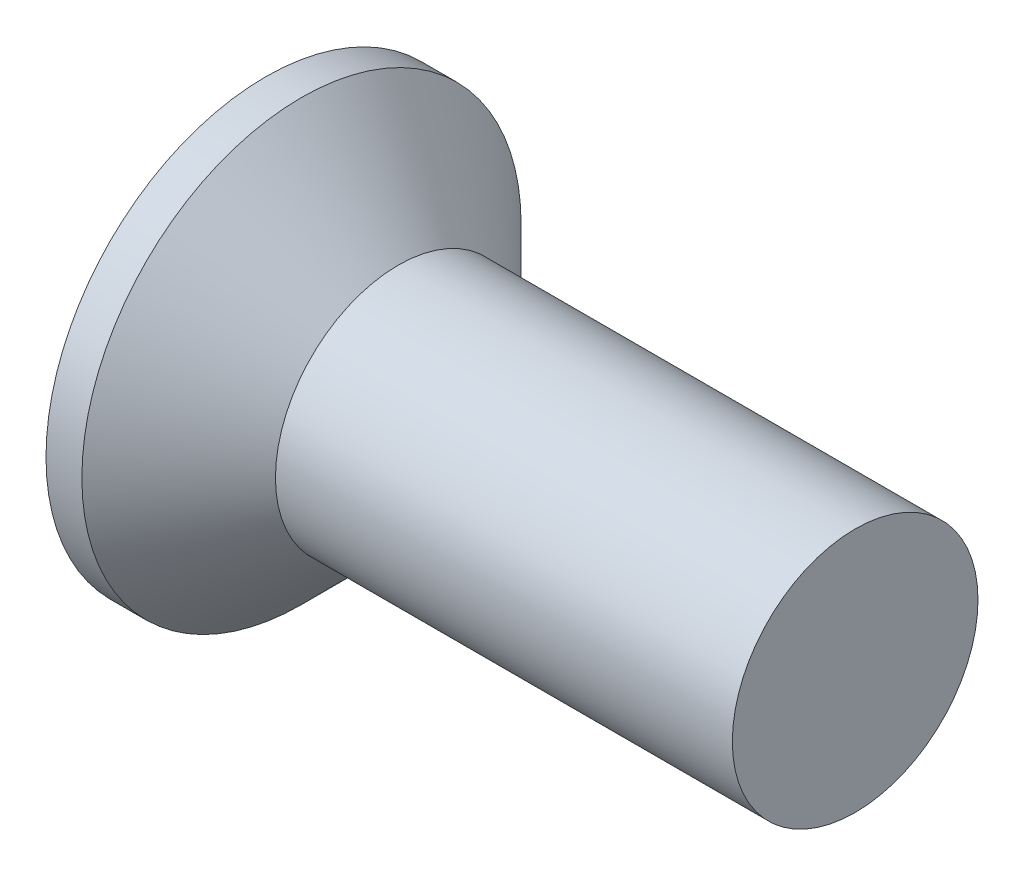
ISO-10303-21;
HEADER;
FILE_DESCRIPTION(('STEP AP214'),'2;1');
FILE_NAME('part.step','',(''),(''),'','','');
FILE_SCHEMA(('AUTOMOTIVE_DESIGN { 1 0 10303 214 1 1 1 1 }'));
ENDSEC;
DATA;
#1=APPLICATION_CONTEXT('core data for automotive mechanical design processes');
#2=APPLICATION_PROTOCOL_DEFINITION('international standard','automotive_design',2000,#1);
#3=PRODUCT_CONTEXT('',#1,'mechanical');
#4=PRODUCT('Part','Part','',(#3));
#5=PRODUCT_RELATED_PRODUCT_CATEGORY('part','',(#4));
#6=PRODUCT_DEFINITION_FORMATION('','',#4);
#7=PRODUCT_DEFINITION_CONTEXT('part definition',#1,'design');
#8=PRODUCT_DEFINITION('design','',#6,#7);
#9=PRODUCT_DEFINITION_SHAPE('','',#8);
#10=(LENGTH_UNIT() NAMED_UNIT(*) SI_UNIT(.MILLI.,.METRE.));
#11=(NAMED_UNIT(*) PLANE_ANGLE_UNIT() SI_UNIT($,.RADIAN.));
#12=(NAMED_UNIT(*) SI_UNIT($,.STERADIAN.) SOLID_ANGLE_UNIT());
#13=UNCERTAINTY_MEASURE_WITH_UNIT(LENGTH_MEASURE(1.E-05),#10,'distance_accuracy_value','');
#14=(GEOMETRIC_REPRESENTATION_CONTEXT(3) GLOBAL_UNCERTAINTY_ASSIGNED_CONTEXT((#13)) GLOBAL_UNIT_ASSIGNED_CONTEXT((#10,
#11,#12)) REPRESENTATION_CONTEXT('',''));
#15=CARTESIAN_POINT('',(0.,0.,0.));
#16=DIRECTION('',(0.,0.,1.));
#17=DIRECTION('',(1.,0.,0.));
#18=AXIS2_PLACEMENT_3D('',#15,#16,#17);
#19=CARTESIAN_POINT('',(1.35,-0.82,-0.82));
#20=DIRECTION('',(-1.,0.,0.));
#21=DIRECTION('',(0.,0.,1.));
#22=AXIS2_PLACEMENT_3D('',#19,#20,#21);
#23=CYLINDRICAL_SURFACE('',#22,0.3);
#24=CARTESIAN_POINT('',(0.,-0.82,-0.82));
#25=DIRECTION('',(-1.,0.,0.));
#26=DIRECTION('',(0.,0.,1.));
#27=AXIS2_PLACEMENT_3D('',#24,#25,#26);
#28=CIRCLE('',#27,0.3);
#29=CARTESIAN_POINT('',(0.,-0.52,-0.82));
#30=VERTEX_POINT('',#29);
#31=CARTESIAN_POINT('',(0.,-0.82,-0.52));
#32=VERTEX_POINT('',#31);
#33=EDGE_CURVE('E19',#30,#32,#28,.F.);
#34=ORIENTED_EDGE('',*,*,#33,.T.);
#35=DIRECTION('',(1.,0.,0.));
#36=VECTOR('',#35,1.);
#37=CARTESIAN_POINT('',(1.35,-0.82,-0.52));
#38=LINE('',#37,#36);
#39=CARTESIAN_POINT('',(1.35,-0.82,-0.52));
#40=VERTEX_POINT('',#39);
#41=EDGE_CURVE('E139',#40,#32,#38,.F.);
#42=ORIENTED_EDGE('',*,*,#41,.F.);
#43=CARTESIAN_POINT('',(1.35,-0.82,-0.82));
#44=DIRECTION('',(-1.,0.,0.));
#45=DIRECTION('',(0.,0.,1.));
#46=AXIS2_PLACEMENT_3D('',#43,#44,#45);
#47=CIRCLE('',#46,0.3);
#48=CARTESIAN_POINT('',(1.35,-0.52,-0.82));
#49=VERTEX_POINT('',#48);
#50=EDGE_CURVE('E296',#40,#49,#47,.T.);
#51=ORIENTED_EDGE('',*,*,#50,.T.);
#52=DIRECTION('',(1.,0.,0.));
#53=VECTOR('',#52,1.);
#54=CARTESIAN_POINT('',(1.35,-0.52,-0.82));
#55=LINE('',#54,#53);
#56=EDGE_CURVE('E243',#30,#49,#55,.T.);
#57=ORIENTED_EDGE('',*,*,#56,.F.);
#58=EDGE_LOOP('',(#34,#42,#51,#57));
#59=FACE_BOUND('',#58,.T.);
#60=ADVANCED_FACE('F16',(#59),#23,.T.);
#61=CARTESIAN_POINT('',(1.35,0.82,-0.82));
#62=DIRECTION('',(-1.,0.,0.));
#63=DIRECTION('',(0.,0.,1.));
#64=AXIS2_PLACEMENT_3D('',#61,#62,#63);
#65=CYLINDRICAL_SURFACE('',#64,0.3);
#66=CARTESIAN_POINT('',(0.,0.82,-0.82));
#67=DIRECTION('',(-1.,0.,0.));
#68=DIRECTION('',(0.,0.,1.));
#69=AXIS2_PLACEMENT_3D('',#66,#67,#68);
#70=CIRCLE('',#69,0.3);
#71=CARTESIAN_POINT('',(0.,0.82,-0.52));
#72=VERTEX_POINT('',#71);
#73=CARTESIAN_POINT('',(0.,0.52,-0.82));
#74=VERTEX_POINT('',#73);
#75=EDGE_CURVE('E303',#72,#74,#70,.F.);
#76=ORIENTED_EDGE('',*,*,#75,.T.);
#77=DIRECTION('',(1.,0.,0.));
#78=VECTOR('',#77,1.);
#79=CARTESIAN_POINT('',(1.35,0.52,-0.82));
#80=LINE('',#79,#78);
#81=CARTESIAN_POINT('',(1.35,0.52,-0.82));
#82=VERTEX_POINT('',#81);
#83=EDGE_CURVE('E222',#82,#74,#80,.F.);
#84=ORIENTED_EDGE('',*,*,#83,.F.);
#85=CARTESIAN_POINT('',(1.35,0.82,-0.82));
#86=DIRECTION('',(-1.,0.,0.));
#87=DIRECTION('',(0.,0.,1.));
#88=AXIS2_PLACEMENT_3D('',#85,#86,#87);
#89=CIRCLE('',#88,0.3);
#90=CARTESIAN_POINT('',(1.35,0.82,-0.52));
#91=VERTEX_POINT('',#90);
#92=EDGE_CURVE('E294',#82,#91,#89,.T.);
#93=ORIENTED_EDGE('',*,*,#92,.T.);
#94=DIRECTION('',(1.,0.,0.));
#95=VECTOR('',#94,1.);
#96=CARTESIAN_POINT('',(1.35,0.82,-0.52));
#97=LINE('',#96,#95);
#98=EDGE_CURVE('E218',#72,#91,#97,.T.);
#99=ORIENTED_EDGE('',*,*,#98,.F.);
#100=EDGE_LOOP('',(#76,#84,#93,#99));
#101=FACE_BOUND('',#100,.T.);
#102=ADVANCED_FACE('F307',(#101),#65,.T.);
#103=CARTESIAN_POINT('',(1.35,0.82,0.82));
#104=DIRECTION('',(-1.,0.,0.));
#105=DIRECTION('',(0.,0.,1.));
#106=AXIS2_PLACEMENT_3D('',#103,#104,#105);
#107=CYLINDRICAL_SURFACE('',#106,0.3);
#108=CARTESIAN_POINT('',(0.,0.82,0.82));
#109=DIRECTION('',(-1.,0.,0.));
#110=DIRECTION('',(0.,0.,1.));
#111=AXIS2_PLACEMENT_3D('',#108,#109,#110);
#112=CIRCLE('',#111,0.3);
#113=CARTESIAN_POINT('',(0.,0.52,0.82));
#114=VERTEX_POINT('',#113);
#115=CARTESIAN_POINT('',(0.,0.82,0.52));
#116=VERTEX_POINT('',#115);
#117=EDGE_CURVE('E302',#114,#116,#112,.F.);
#118=ORIENTED_EDGE('',*,*,#117,.T.);
#119=DIRECTION('',(1.,0.,0.));
#120=VECTOR('',#119,1.);
#121=CARTESIAN_POINT('',(1.35,0.82,0.52));
#122=LINE('',#121,#120);
#123=CARTESIAN_POINT('',(1.35,0.82,0.52));
#124=VERTEX_POINT('',#123);
#125=EDGE_CURVE('E196',#124,#116,#122,.F.);
#126=ORIENTED_EDGE('',*,*,#125,.F.);
#127=CARTESIAN_POINT('',(1.35,0.82,0.82));
#128=DIRECTION('',(-1.,0.,0.));
#129=DIRECTION('',(0.,0.,1.));
#130=AXIS2_PLACEMENT_3D('',#127,#128,#129);
#131=CIRCLE('',#130,0.3);
#132=CARTESIAN_POINT('',(1.35,0.52,0.82));
#133=VERTEX_POINT('',#132);
#134=EDGE_CURVE('E251',#124,#133,#131,.T.);
#135=ORIENTED_EDGE('',*,*,#134,.T.);
#136=DIRECTION('',(1.,0.,0.));
#137=VECTOR('',#136,1.);
#138=CARTESIAN_POINT('',(1.35,0.52,0.82));
#139=LINE('',#138,#137);
#140=EDGE_CURVE('E192',#114,#133,#139,.T.);
#141=ORIENTED_EDGE('',*,*,#140,.F.);
#142=EDGE_LOOP('',(#118,#126,#135,#141));
#143=FACE_BOUND('',#142,.T.);
#144=ADVANCED_FACE('F540',(#143),#107,.T.);
#145=CARTESIAN_POINT('',(1.35,-0.82,0.819999999999999));
#146=DIRECTION('',(-1.,0.,0.));
#147=DIRECTION('',(0.,0.,1.));
#148=AXIS2_PLACEMENT_3D('',#145,#146,#147);
#149=CYLINDRICAL_SURFACE('',#148,0.3);
#150=CARTESIAN_POINT('',(0.,-0.82,0.819999999999999));
#151=DIRECTION('',(-1.,0.,0.));
#152=DIRECTION('',(0.,0.,1.));
#153=AXIS2_PLACEMENT_3D('',#150,#151,#152);
#154=CIRCLE('',#153,0.3);
#155=CARTESIAN_POINT('',(0.,-0.82,0.52));
#156=VERTEX_POINT('',#155);
#157=CARTESIAN_POINT('',(0.,-0.52,0.82));
#158=VERTEX_POINT('',#157);
#159=EDGE_CURVE('E300',#156,#158,#154,.F.);
#160=ORIENTED_EDGE('',*,*,#159,.T.);
#161=DIRECTION('',(1.,0.,0.));
#162=VECTOR('',#161,1.);
#163=CARTESIAN_POINT('',(1.35,-0.52,0.82));
#164=LINE('',#163,#162);
#165=CARTESIAN_POINT('',(1.35,-0.52,0.82));
#166=VERTEX_POINT('',#165);
#167=EDGE_CURVE('E170',#166,#158,#164,.F.);
#168=ORIENTED_EDGE('',*,*,#167,.F.);
#169=CARTESIAN_POINT('',(1.35,-0.82,0.819999999999999));
#170=DIRECTION('',(-1.,0.,0.));
#171=DIRECTION('',(0.,0.,1.));
#172=AXIS2_PLACEMENT_3D('',#169,#170,#171);
#173=CIRCLE('',#172,0.3);
#174=CARTESIAN_POINT('',(1.35,-0.82,0.52));
#175=VERTEX_POINT('',#174);
#176=EDGE_CURVE('E298',#166,#175,#173,.T.);
#177=ORIENTED_EDGE('',*,*,#176,.T.);
#178=DIRECTION('',(1.,0.,0.));
#179=VECTOR('',#178,1.);
#180=CARTESIAN_POINT('',(1.35,-0.82,0.52));
#181=LINE('',#180,#179);
#182=EDGE_CURVE('E162',#156,#175,#181,.T.);
#183=ORIENTED_EDGE('',*,*,#182,.F.);
#184=EDGE_LOOP('',(#160,#168,#177,#183));
#185=FACE_BOUND('',#184,.T.);
#186=ADVANCED_FACE('F531',(#185),#149,.T.);
#187=CARTESIAN_POINT('',(1.35,0.52,0.52));
#188=DIRECTION('',(1.,0.,0.));
#189=DIRECTION('',(0.,0.,-1.));
#190=AXIS2_PLACEMENT_3D('',#187,#188,#189);
#191=PLANE('',#190);
#192=ORIENTED_EDGE('',*,*,#134,.F.);
#193=DIRECTION('',(0.,1.,0.));
#194=VECTOR('',#193,1.);
#195=CARTESIAN_POINT('',(1.35,0.52,0.52));
#196=LINE('',#195,#194);
#197=CARTESIAN_POINT('',(1.35,1.820577136594,0.52));
#198=VERTEX_POINT('',#197);
#199=EDGE_CURVE('E199',#198,#124,#196,.F.);
#200=ORIENTED_EDGE('',*,*,#199,.F.);
#201=DIRECTION('',(0.,0.,1.));
#202=VECTOR('',#201,1.);
#203=CARTESIAN_POINT('',(1.35,1.820577136594,-0.52));
#204=LINE('',#203,#202);
#205=CARTESIAN_POINT('',(1.35,1.820577136594,-0.52));
#206=VERTEX_POINT('',#205);
#207=EDGE_CURVE('E214',#206,#198,#204,.T.);
#208=ORIENTED_EDGE('',*,*,#207,.F.);
#209=DIRECTION('',(0.,1.,0.));
#210=VECTOR('',#209,1.);
#211=CARTESIAN_POINT('',(1.35,0.52,-0.52));
#212=LINE('',#211,#210);
#213=EDGE_CURVE('E215',#91,#206,#212,.T.);
#214=ORIENTED_EDGE('',*,*,#213,.F.);
#215=ORIENTED_EDGE('',*,*,#92,.F.);
#216=DIRECTION('',(0.,0.,-1.));
#217=VECTOR('',#216,1.);
#218=CARTESIAN_POINT('',(1.35,0.52,-0.52));
#219=LINE('',#218,#217);
#220=CARTESIAN_POINT('',(1.35,0.52,-1.820577136594));
#221=VERTEX_POINT('',#220);
#222=EDGE_CURVE('E225',#221,#82,#219,.F.);
#223=ORIENTED_EDGE('',*,*,#222,.F.);
#224=DIRECTION('',(0.,1.,0.));
#225=VECTOR('',#224,1.);
#226=CARTESIAN_POINT('',(1.35,0.52,-1.820577136594));
#227=LINE('',#226,#225);
#228=CARTESIAN_POINT('',(1.35,-0.52,-1.820577136594));
#229=VERTEX_POINT('',#228);
#230=EDGE_CURVE('E239',#229,#221,#227,.T.);
#231=ORIENTED_EDGE('',*,*,#230,.F.);
#232=DIRECTION('',(0.,0.,1.));
#233=VECTOR('',#232,1.);
#234=CARTESIAN_POINT('',(1.35,-0.52,-0.52));
#235=LINE('',#234,#233);
#236=EDGE_CURVE('E240',#49,#229,#235,.F.);
#237=ORIENTED_EDGE('',*,*,#236,.F.);
#238=ORIENTED_EDGE('',*,*,#50,.F.);
#239=DIRECTION('',(0.,1.,0.));
#240=VECTOR('',#239,1.);
#241=CARTESIAN_POINT('',(1.35,-0.52,-0.52));
#242=LINE('',#241,#240);
#243=CARTESIAN_POINT('',(1.35,-1.820577136594,-0.52));
#244=VERTEX_POINT('',#243);
#245=EDGE_CURVE('E246',#244,#40,#242,.T.);
#246=ORIENTED_EDGE('',*,*,#245,.F.);
#247=DIRECTION('',(0.,0.,1.));
#248=VECTOR('',#247,1.);
#249=CARTESIAN_POINT('',(1.35,-1.820577136594,-0.52));
#250=LINE('',#249,#248);
#251=CARTESIAN_POINT('',(1.35,-1.820577136594,0.519999999999999));
#252=VERTEX_POINT('',#251);
#253=EDGE_CURVE('E148',#252,#244,#250,.F.);
#254=ORIENTED_EDGE('',*,*,#253,.F.);
#255=DIRECTION('',(0.,1.,0.));
#256=VECTOR('',#255,1.);
#257=CARTESIAN_POINT('',(1.35,-0.52,0.52));
#258=LINE('',#257,#256);
#259=EDGE_CURVE('E167',#175,#252,#258,.F.);
#260=ORIENTED_EDGE('',*,*,#259,.F.);
#261=ORIENTED_EDGE('',*,*,#176,.F.);
#262=DIRECTION('',(0.,0.,1.));
#263=VECTOR('',#262,1.);
#264=CARTESIAN_POINT('',(1.35,-0.52,0.52));
#265=LINE('',#264,#263);
#266=CARTESIAN_POINT('',(1.35,-0.52,1.820577136594));
#267=VERTEX_POINT('',#266);
#268=EDGE_CURVE('E174',#267,#166,#265,.F.);
#269=ORIENTED_EDGE('',*,*,#268,.F.);
#270=DIRECTION('',(0.,1.,0.));
#271=VECTOR('',#270,1.);
#272=CARTESIAN_POINT('',(1.35,0.52,1.820577136594));
#273=LINE('',#272,#271);
#274=CARTESIAN_POINT('',(1.35,0.52,1.820577136594));
#275=VERTEX_POINT('',#274);
#276=EDGE_CURVE('E188',#275,#267,#273,.F.);
#277=ORIENTED_EDGE('',*,*,#276,.F.);
#278=DIRECTION('',(0.,0.,-1.));
#279=VECTOR('',#278,1.);
#280=CARTESIAN_POINT('',(1.35,0.52,0.52));
#281=LINE('',#280,#279);
#282=EDGE_CURVE('E189',#133,#275,#281,.F.);
#283=ORIENTED_EDGE('',*,*,#282,.F.);
#284=EDGE_LOOP('',(#192,#200,#208,#214,#215,#223,#231,#237,#238,#246,#254,#260,#261,#269,#277,#283));
#285=FACE_BOUND('',#284,.T.);
#286=ADVANCED_FACE('F333',(#285),#191,.F.);
#287=CARTESIAN_POINT('',(1.35,-0.52,-0.52));
#288=DIRECTION('',(0.,0.,1.));
#289=DIRECTION('',(1.,0.,0.));
#290=AXIS2_PLACEMENT_3D('',#287,#288,#289);
#291=PLANE('',#290);
#292=DIRECTION('',(0.,1.,0.));
#293=VECTOR('',#292,1.);
#294=CARTESIAN_POINT('',(0.,4.47,-0.52));
#295=LINE('',#294,#293);
#296=CARTESIAN_POINT('',(0.,-2.6,-0.52));
#297=VERTEX_POINT('',#296);
#298=EDGE_CURVE('E133',#297,#32,#295,.T.);
#299=ORIENTED_EDGE('',*,*,#298,.F.);
#300=DIRECTION('',(-0.866025403784438,-0.500000000000001,0.));
#301=VECTOR('',#300,1.);
#302=CARTESIAN_POINT('',(0.,-2.6,-0.52));
#303=LINE('',#302,#301);
#304=EDGE_CURVE('E137',#244,#297,#303,.T.);
#305=ORIENTED_EDGE('',*,*,#304,.F.);
#306=ORIENTED_EDGE('',*,*,#245,.T.);
#307=ORIENTED_EDGE('',*,*,#41,.T.);
#308=EDGE_LOOP('',(#299,#305,#306,#307));
#309=FACE_BOUND('',#308,.T.);
#310=ADVANCED_FACE('F135',(#309),#291,.T.);
#311=CARTESIAN_POINT('',(1.35,-0.52,-0.52));
#312=DIRECTION('',(0.,1.,0.));
#313=DIRECTION('',(0.,0.,1.));
#314=AXIS2_PLACEMENT_3D('',#311,#312,#313);
#315=PLANE('',#314);
#316=ORIENTED_EDGE('',*,*,#236,.T.);
#317=DIRECTION('',(0.866025403784438,0.,0.500000000000001));
#318=VECTOR('',#317,1.);
#319=CARTESIAN_POINT('',(0.,-0.52,-2.6));
#320=LINE('',#319,#318);
#321=CARTESIAN_POINT('',(0.,-0.52,-2.6));
#322=VERTEX_POINT('',#321);
#323=EDGE_CURVE('E236',#322,#229,#320,.T.);
#324=ORIENTED_EDGE('',*,*,#323,.F.);
#325=DIRECTION('',(0.,0.,1.));
#326=VECTOR('',#325,1.);
#327=CARTESIAN_POINT('',(0.,-0.52,0.));
#328=LINE('',#327,#326);
#329=EDGE_CURVE('E141',#30,#322,#328,.F.);
#330=ORIENTED_EDGE('',*,*,#329,.F.);
#331=ORIENTED_EDGE('',*,*,#56,.T.);
#332=EDGE_LOOP('',(#316,#324,#330,#331));
#333=FACE_BOUND('',#332,.T.);
#334=ADVANCED_FACE('F327',(#333),#315,.T.);
#335=CARTESIAN_POINT('',(0.,0.52,-2.6));
#336=DIRECTION('',(-0.500000000000001,0.,0.866025403784438));
#337=DIRECTION('',(0.866025403784438,0.,0.500000000000001));
#338=AXIS2_PLACEMENT_3D('',#335,#336,#337);
#339=PLANE('',#338);
#340=ORIENTED_EDGE('',*,*,#230,.T.);
#341=DIRECTION('',(0.866025403784438,0.,0.500000000000001));
#342=VECTOR('',#341,1.);
#343=CARTESIAN_POINT('',(0.,0.52,-2.6));
#344=LINE('',#343,#342);
#345=CARTESIAN_POINT('',(0.,0.52,-2.6));
#346=VERTEX_POINT('',#345);
#347=EDGE_CURVE('E221',#346,#221,#344,.T.);
#348=ORIENTED_EDGE('',*,*,#347,.F.);
#349=DIRECTION('',(0.,1.,0.));
#350=VECTOR('',#349,1.);
#351=CARTESIAN_POINT('',(0.,4.47,-2.6));
#352=LINE('',#351,#350);
#353=EDGE_CURVE('E230',#322,#346,#352,.T.);
#354=ORIENTED_EDGE('',*,*,#353,.F.);
#355=ORIENTED_EDGE('',*,*,#323,.T.);
#356=EDGE_LOOP('',(#340,#348,#354,#355));
#357=FACE_BOUND('',#356,.T.);
#358=ADVANCED_FACE('F331',(#357),#339,.T.);
#359=CARTESIAN_POINT('',(1.35,0.52,-0.52));
#360=DIRECTION('',(0.,-1.,0.));
#361=DIRECTION('',(0.,0.,-1.));
#362=AXIS2_PLACEMENT_3D('',#359,#360,#361);
#363=PLANE('',#362);
#364=DIRECTION('',(0.,0.,1.));
#365=VECTOR('',#364,1.);
#366=CARTESIAN_POINT('',(0.,0.52,0.));
#367=LINE('',#366,#365);
#368=EDGE_CURVE('E233',#346,#74,#367,.T.);
#369=ORIENTED_EDGE('',*,*,#368,.F.);
#370=ORIENTED_EDGE('',*,*,#347,.T.);
#371=ORIENTED_EDGE('',*,*,#222,.T.);
#372=ORIENTED_EDGE('',*,*,#83,.T.);
#373=EDGE_LOOP('',(#369,#370,#371,#372));
#374=FACE_BOUND('',#373,.T.);
#375=ADVANCED_FACE('F313',(#374),#363,.T.);
#376=CARTESIAN_POINT('',(1.35,0.52,-0.52));
#377=DIRECTION('',(0.,0.,1.));
#378=DIRECTION('',(1.,0.,0.));
#379=AXIS2_PLACEMENT_3D('',#376,#377,#378);
#380=PLANE('',#379);
#381=ORIENTED_EDGE('',*,*,#213,.T.);
#382=DIRECTION('',(0.866025403784438,-0.500000000000001,0.));
#383=VECTOR('',#382,1.);
#384=CARTESIAN_POINT('',(0.,2.6,-0.52));
#385=LINE('',#384,#383);
#386=CARTESIAN_POINT('',(0.,2.6,-0.52));
#387=VERTEX_POINT('',#386);
#388=EDGE_CURVE('E211',#387,#206,#385,.T.);
#389=ORIENTED_EDGE('',*,*,#388,.F.);
#390=DIRECTION('',(0.,1.,0.));
#391=VECTOR('',#390,1.);
#392=CARTESIAN_POINT('',(0.,4.47,-0.52));
#393=LINE('',#392,#391);
#394=EDGE_CURVE('E208',#72,#387,#393,.T.);
#395=ORIENTED_EDGE('',*,*,#394,.F.);
#396=ORIENTED_EDGE('',*,*,#98,.T.);
#397=EDGE_LOOP('',(#381,#389,#395,#396));
#398=FACE_BOUND('',#397,.T.);
#399=ADVANCED_FACE('F337',(#398),#380,.T.);
#400=CARTESIAN_POINT('',(0.,2.6,-0.52));
#401=DIRECTION('',(-0.500000000000001,-0.866025403784438,0.));
#402=DIRECTION('',(0.866025403784438,-0.500000000000001,0.));
#403=AXIS2_PLACEMENT_3D('',#400,#401,#402);
#404=PLANE('',#403);
#405=ORIENTED_EDGE('',*,*,#207,.T.);
#406=DIRECTION('',(0.866025403784438,-0.500000000000001,0.));
#407=VECTOR('',#406,1.);
#408=CARTESIAN_POINT('',(0.,2.6,0.52));
#409=LINE('',#408,#407);
#410=CARTESIAN_POINT('',(0.,2.6,0.52));
#411=VERTEX_POINT('',#410);
#412=EDGE_CURVE('E195',#411,#198,#409,.T.);
#413=ORIENTED_EDGE('',*,*,#412,.F.);
#414=DIRECTION('',(0.,0.,1.));
#415=VECTOR('',#414,1.);
#416=CARTESIAN_POINT('',(0.,2.6,0.));
#417=LINE('',#416,#415);
#418=EDGE_CURVE('E204',#387,#411,#417,.T.);
#419=ORIENTED_EDGE('',*,*,#418,.F.);
#420=ORIENTED_EDGE('',*,*,#388,.T.);
#421=EDGE_LOOP('',(#405,#413,#419,#420));
#422=FACE_BOUND('',#421,.T.);
#423=ADVANCED_FACE('F342',(#422),#404,.T.);
#424=CARTESIAN_POINT('',(1.35,0.52,0.52));
#425=DIRECTION('',(0.,0.,-1.));
#426=DIRECTION('',(0.,1.,0.));
#427=AXIS2_PLACEMENT_3D('',#424,#425,#426);
#428=PLANE('',#427);
#429=DIRECTION('',(0.,1.,0.));
#430=VECTOR('',#429,1.);
#431=CARTESIAN_POINT('',(0.,4.47,0.52));
#432=LINE('',#431,#430);
#433=EDGE_CURVE('E207',#411,#116,#432,.F.);
#434=ORIENTED_EDGE('',*,*,#433,.F.);
#435=ORIENTED_EDGE('',*,*,#412,.T.);
#436=ORIENTED_EDGE('',*,*,#199,.T.);
#437=ORIENTED_EDGE('',*,*,#125,.T.);
#438=EDGE_LOOP('',(#434,#435,#436,#437));
#439=FACE_BOUND('',#438,.T.);
#440=ADVANCED_FACE('F344',(#439),#428,.T.);
#441=CARTESIAN_POINT('',(1.35,0.52,0.52));
#442=DIRECTION('',(0.,-1.,0.));
#443=DIRECTION('',(0.,0.,-1.));
#444=AXIS2_PLACEMENT_3D('',#441,#442,#443);
#445=PLANE('',#444);
#446=ORIENTED_EDGE('',*,*,#282,.T.);
#447=DIRECTION('',(-0.866025403784438,0.,0.500000000000001));
#448=VECTOR('',#447,1.);
#449=CARTESIAN_POINT('',(0.,0.52,2.6));
#450=LINE('',#449,#448);
#451=CARTESIAN_POINT('',(0.,0.52,2.6));
#452=VERTEX_POINT('',#451);
#453=EDGE_CURVE('E185',#452,#275,#450,.F.);
#454=ORIENTED_EDGE('',*,*,#453,.F.);
#455=DIRECTION('',(0.,0.,1.));
#456=VECTOR('',#455,1.);
#457=CARTESIAN_POINT('',(0.,0.52,0.));
#458=LINE('',#457,#456);
#459=EDGE_CURVE('E182',#114,#452,#458,.T.);
#460=ORIENTED_EDGE('',*,*,#459,.F.);
#461=ORIENTED_EDGE('',*,*,#140,.T.);
#462=EDGE_LOOP('',(#446,#454,#460,#461));
#463=FACE_BOUND('',#462,.T.);
#464=ADVANCED_FACE('F456',(#463),#445,.T.);
#465=CARTESIAN_POINT('',(0.,0.52,2.6));
#466=DIRECTION('',(-0.500000000000001,0.,-0.866025403784438));
#467=DIRECTION('',(-0.866025403784438,0.,0.500000000000001));
#468=AXIS2_PLACEMENT_3D('',#465,#466,#467);
#469=PLANE('',#468);
#470=ORIENTED_EDGE('',*,*,#276,.T.);
#471=DIRECTION('',(0.866025403784438,0.,-0.500000000000001));
#472=VECTOR('',#471,1.);
#473=CARTESIAN_POINT('',(0.,-0.520000000000001,2.6));
#474=LINE('',#473,#472);
#475=CARTESIAN_POINT('',(0.,-0.520000000000001,2.6));
#476=VERTEX_POINT('',#475);
#477=EDGE_CURVE('E173',#476,#267,#474,.T.);
#478=ORIENTED_EDGE('',*,*,#477,.F.);
#479=DIRECTION('',(0.,1.,0.));
#480=VECTOR('',#479,1.);
#481=CARTESIAN_POINT('',(0.,4.47,2.6));
#482=LINE('',#481,#480);
#483=EDGE_CURVE('E179',#452,#476,#482,.F.);
#484=ORIENTED_EDGE('',*,*,#483,.F.);
#485=ORIENTED_EDGE('',*,*,#453,.T.);
#486=EDGE_LOOP('',(#470,#478,#484,#485));
#487=FACE_BOUND('',#486,.T.);
#488=ADVANCED_FACE('F446',(#487),#469,.T.);
#489=CARTESIAN_POINT('',(1.35,-0.52,0.52));
#490=DIRECTION('',(0.,1.,0.));
#491=DIRECTION('',(0.,0.,1.));
#492=AXIS2_PLACEMENT_3D('',#489,#490,#491);
#493=PLANE('',#492);
#494=DIRECTION('',(0.,0.,1.));
#495=VECTOR('',#494,1.);
#496=CARTESIAN_POINT('',(0.,-0.52,0.));
#497=LINE('',#496,#495);
#498=EDGE_CURVE('E158',#476,#158,#497,.F.);
#499=ORIENTED_EDGE('',*,*,#498,.F.);
#500=ORIENTED_EDGE('',*,*,#477,.T.);
#501=ORIENTED_EDGE('',*,*,#268,.T.);
#502=ORIENTED_EDGE('',*,*,#167,.T.);
#503=EDGE_LOOP('',(#499,#500,#501,#502));
#504=FACE_BOUND('',#503,.T.);
#505=ADVANCED_FACE('F437',(#504),#493,.T.);
#506=CARTESIAN_POINT('',(1.35,-0.52,0.52));
#507=DIRECTION('',(0.,0.,-1.));
#508=DIRECTION('',(0.,1.,0.));
#509=AXIS2_PLACEMENT_3D('',#506,#507,#508);
#510=PLANE('',#509);
#511=ORIENTED_EDGE('',*,*,#259,.T.);
#512=DIRECTION('',(-0.866025403784438,-0.500000000000001,0.));
#513=VECTOR('',#512,1.);
#514=CARTESIAN_POINT('',(0.,-2.6,0.519999999999999));
#515=LINE('',#514,#513);
#516=CARTESIAN_POINT('',(0.,-2.6,0.52));
#517=VERTEX_POINT('',#516);
#518=EDGE_CURVE('E34',#517,#252,#515,.F.);
#519=ORIENTED_EDGE('',*,*,#518,.F.);
#520=DIRECTION('',(0.,1.,0.));
#521=VECTOR('',#520,1.);
#522=CARTESIAN_POINT('',(0.,4.47,0.52));
#523=LINE('',#522,#521);
#524=EDGE_CURVE('E152',#156,#517,#523,.F.);
#525=ORIENTED_EDGE('',*,*,#524,.F.);
#526=ORIENTED_EDGE('',*,*,#182,.T.);
#527=EDGE_LOOP('',(#511,#519,#525,#526));
#528=FACE_BOUND('',#527,.T.);
#529=ADVANCED_FACE('F428',(#528),#510,.T.);
#530=CARTESIAN_POINT('',(0.,-2.6,-0.52));
#531=DIRECTION('',(-0.500000000000001,0.866025403784438,0.));
#532=DIRECTION('',(-0.866025403784438,-0.500000000000001,0.));
#533=AXIS2_PLACEMENT_3D('',#530,#531,#532);
#534=PLANE('',#533);
#535=ORIENTED_EDGE('',*,*,#253,.T.);
#536=ORIENTED_EDGE('',*,*,#304,.T.);
#537=DIRECTION('',(0.,0.,1.));
#538=VECTOR('',#537,1.);
#539=CARTESIAN_POINT('',(0.,-2.6,0.));
#540=LINE('',#539,#538);
#541=EDGE_CURVE('E145',#517,#297,#540,.F.);
#542=ORIENTED_EDGE('',*,*,#541,.F.);
#543=ORIENTED_EDGE('',*,*,#518,.T.);
#544=EDGE_LOOP('',(#535,#536,#542,#543));
#545=FACE_BOUND('',#544,.T.);
#546=ADVANCED_FACE('F144',(#545),#534,.T.);
#547=CARTESIAN_POINT('',(0.,4.47,0.));
#548=DIRECTION('',(-1.,0.,0.));
#549=DIRECTION('',(0.,0.,1.));
#550=AXIS2_PLACEMENT_3D('',#547,#548,#549);
#551=PLANE('',#550);
#552=ORIENTED_EDGE('',*,*,#524,.T.);
#553=ORIENTED_EDGE('',*,*,#541,.T.);
#554=ORIENTED_EDGE('',*,*,#298,.T.);
#555=ORIENTED_EDGE('',*,*,#33,.F.);
#556=ORIENTED_EDGE('',*,*,#329,.T.);
#557=ORIENTED_EDGE('',*,*,#353,.T.);
#558=ORIENTED_EDGE('',*,*,#368,.T.);
#559=ORIENTED_EDGE('',*,*,#75,.F.);
#560=ORIENTED_EDGE('',*,*,#394,.T.);
#561=ORIENTED_EDGE('',*,*,#418,.T.);
#562=ORIENTED_EDGE('',*,*,#433,.T.);
#563=ORIENTED_EDGE('',*,*,#117,.F.);
#564=ORIENTED_EDGE('',*,*,#459,.T.);
#565=ORIENTED_EDGE('',*,*,#483,.T.);
#566=ORIENTED_EDGE('',*,*,#498,.T.);
#567=ORIENTED_EDGE('',*,*,#159,.F.);
#568=EDGE_LOOP('',(#552,#553,#554,#555,#556,#557,#558,#559,#560,#561,#562,#563,#564,#565,#566,#567));
#569=FACE_BOUND('',#568,.T.);
#570=CARTESIAN_POINT('',(0.,0.,0.));
#571=DIRECTION('',(1.,0.,0.));
#572=DIRECTION('',(0.,0.,-1.));
#573=AXIS2_PLACEMENT_3D('',#570,#571,#572);
#574=CIRCLE('',#573,4.47);
#575=CARTESIAN_POINT('',(0.,0.,-4.47));
#576=VERTEX_POINT('',#575);
#577=EDGE_CURVE('E153',#576,#576,#574,.T.);
#578=ORIENTED_EDGE('',*,*,#577,.F.);
#579=EDGE_LOOP('',(#578));
#580=FACE_BOUND('',#579,.T.);
#581=ADVANCED_FACE('F150',(#569,#580),#551,.T.);
#582=CARTESIAN_POINT('',(4.51581291088132,0.,0.));
#583=DIRECTION('',(1.,0.,0.));
#584=DIRECTION('',(0.,0.,-1.));
#585=AXIS2_PLACEMENT_3D('',#582,#583,#584);
#586=CYLINDRICAL_SURFACE('',#585,4.47);
#587=CARTESIAN_POINT('',(0.730000000089603,0.,0.));
#588=DIRECTION('',(-1.,0.,0.));
#589=DIRECTION('',(0.,0.,1.));
#590=AXIS2_PLACEMENT_3D('',#587,#588,#589);
#591=CIRCLE('',#590,4.46999999996933);
#592=CARTESIAN_POINT('',(0.730000000089603,0.,4.46999999996933));
#593=VERTEX_POINT('',#592);
#594=EDGE_CURVE('E156',#593,#593,#591,.F.);
#595=ORIENTED_EDGE('',*,*,#594,.F.);
#596=EDGE_LOOP('',(#595));
#597=FACE_BOUND('',#596,.T.);
#598=ORIENTED_EDGE('',*,*,#577,.T.);
#599=EDGE_LOOP('',(#598));
#600=FACE_BOUND('',#599,.T.);
#601=ADVANCED_FACE('F370',(#597,#600),#586,.T.);
#602=CARTESIAN_POINT('',(0.730000000146447,0.,0.));
#603=DIRECTION('',(-1.,0.,0.));
#604=DIRECTION('',(0.,0.,1.));
#605=AXIS2_PLACEMENT_3D('',#602,#603,#604);
#606=CONICAL_SURFACE('',#605,4.46999999991249,0.785398163397448);
#607=ORIENTED_EDGE('',*,*,#594,.T.);
#608=EDGE_LOOP('',(#607));
#609=FACE_BOUND('',#608,.T.);
#610=CARTESIAN_POINT('',(2.7,0.,0.));
#611=DIRECTION('',(1.,0.,0.));
#612=DIRECTION('',(0.,0.,-1.));
#613=AXIS2_PLACEMENT_3D('',#610,#611,#612);
#614=CIRCLE('',#613,2.5);
#615=CARTESIAN_POINT('',(2.7,0.,-2.5));
#616=VERTEX_POINT('',#615);
#617=EDGE_CURVE('E25',#616,#616,#614,.T.);
#618=ORIENTED_EDGE('',*,*,#617,.F.);
#619=EDGE_LOOP('',(#618));
#620=FACE_BOUND('',#619,.T.);
#621=ADVANCED_FACE('F367',(#609,#620),#606,.T.);
#622=CARTESIAN_POINT('',(12.,2.5,0.));
#623=DIRECTION('',(1.,0.,0.));
#624=DIRECTION('',(0.,0.,-1.));
#625=AXIS2_PLACEMENT_3D('',#622,#623,#624);
#626=PLANE('',#625);
#627=CARTESIAN_POINT('',(12.,0.,0.));
#628=DIRECTION('',(1.,0.,0.));
#629=DIRECTION('',(0.,0.,-1.));
#630=AXIS2_PLACEMENT_3D('',#627,#628,#629);
#631=CIRCLE('',#630,2.5);
#632=CARTESIAN_POINT('',(12.,0.,-2.5));
#633=VERTEX_POINT('',#632);
#634=EDGE_CURVE('E11',#633,#633,#631,.F.);
#635=ORIENTED_EDGE('',*,*,#634,.F.);
#636=EDGE_LOOP('',(#635));
#637=FACE_BOUND('',#636,.T.);
#638=ADVANCED_FACE('F369',(#637),#626,.T.);
#639=CARTESIAN_POINT('',(4.51581291088132,0.,0.));
#640=DIRECTION('',(1.,0.,0.));
#641=DIRECTION('',(0.,0.,-1.));
#642=AXIS2_PLACEMENT_3D('',#639,#640,#641);
#643=CYLINDRICAL_SURFACE('',#642,2.5);
#644=ORIENTED_EDGE('',*,*,#634,.T.);
#645=EDGE_LOOP('',(#644));
#646=FACE_BOUND('',#645,.T.);
#647=ORIENTED_EDGE('',*,*,#617,.T.);
#648=EDGE_LOOP('',(#647));
#649=FACE_BOUND('',#648,.T.);
#650=ADVANCED_FACE('F365',(#646,#649),#643,.T.);
#651=CLOSED_SHELL('',(#60,#102,#144,#186,#286,#310,#334,#358,#375,#399,#423,#440,#464,#488,#505,
#529,#546,#581,#601,#621,#638,#650));
#652=MANIFOLD_SOLID_BREP('B1',#651);
#653=ADVANCED_BREP_SHAPE_REPRESENTATION('',(#18,#652),#14);
#654=SHAPE_DEFINITION_REPRESENTATION(#9,#653);
ENDSEC;
END-ISO-10303-21;
